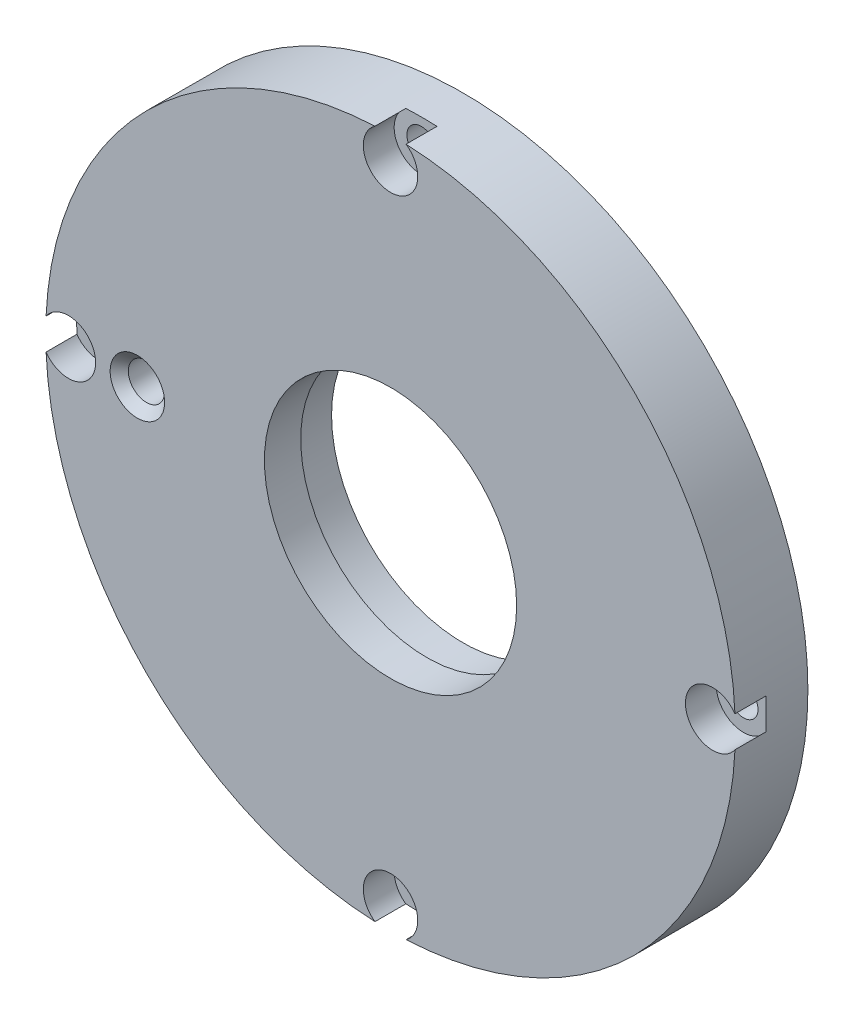
ISO-10303-21;
HEADER;
FILE_DESCRIPTION(('STEP AP214'),'2;1');
FILE_NAME('part.step','',(''),(''),'','','');
FILE_SCHEMA(('AUTOMOTIVE_DESIGN { 1 0 10303 214 1 1 1 1 }'));
ENDSEC;
DATA;
#1=APPLICATION_CONTEXT('core data for automotive mechanical design processes');
#2=APPLICATION_PROTOCOL_DEFINITION('international standard','automotive_design',2000,#1);
#3=PRODUCT_CONTEXT('',#1,'mechanical');
#4=PRODUCT('Part','Part','',(#3));
#5=PRODUCT_RELATED_PRODUCT_CATEGORY('part','',(#4));
#6=PRODUCT_DEFINITION_FORMATION('','',#4);
#7=PRODUCT_DEFINITION_CONTEXT('part definition',#1,'design');
#8=PRODUCT_DEFINITION('design','',#6,#7);
#9=PRODUCT_DEFINITION_SHAPE('','',#8);
#10=(LENGTH_UNIT() NAMED_UNIT(*) SI_UNIT(.MILLI.,.METRE.));
#11=(NAMED_UNIT(*) PLANE_ANGLE_UNIT() SI_UNIT($,.RADIAN.));
#12=(NAMED_UNIT(*) SI_UNIT($,.STERADIAN.) SOLID_ANGLE_UNIT());
#13=UNCERTAINTY_MEASURE_WITH_UNIT(LENGTH_MEASURE(1.E-05),#10,'distance_accuracy_value','');
#14=(GEOMETRIC_REPRESENTATION_CONTEXT(3) GLOBAL_UNCERTAINTY_ASSIGNED_CONTEXT((#13)) GLOBAL_UNIT_ASSIGNED_CONTEXT((#10,
#11,#12)) REPRESENTATION_CONTEXT('',''));
#15=CARTESIAN_POINT('',(0.,0.,0.));
#16=DIRECTION('',(0.,0.,1.));
#17=DIRECTION('',(1.,0.,0.));
#18=AXIS2_PLACEMENT_3D('',#15,#16,#17);
#19=CARTESIAN_POINT('',(0.,0.,0.));
#20=DIRECTION('',(0.,0.,1.));
#21=DIRECTION('',(1.,0.,0.));
#22=AXIS2_PLACEMENT_3D('',#19,#20,#21);
#23=PLANE('',#22);
#24=CARTESIAN_POINT('',(0.,0.,0.));
#25=DIRECTION('',(0.,0.,1.));
#26=DIRECTION('',(1.,0.,0.));
#27=AXIS2_PLACEMENT_3D('',#24,#25,#26);
#28=CIRCLE('',#27,38.);
#29=CARTESIAN_POINT('',(38.,0.,0.));
#30=VERTEX_POINT('',#29);
#31=EDGE_CURVE('E129',#30,#30,#28,.T.);
#32=ORIENTED_EDGE('',*,*,#31,.F.);
#33=EDGE_LOOP('',(#32));
#34=FACE_BOUND('',#33,.T.);
#35=CARTESIAN_POINT('',(-35.5,0.,0.));
#36=DIRECTION('',(0.,0.,1.));
#37=DIRECTION('',(1.,0.,0.));
#38=AXIS2_PLACEMENT_3D('',#35,#36,#37);
#39=CIRCLE('',#38,1.6);
#40=CARTESIAN_POINT('',(-33.9,0.,0.));
#41=VERTEX_POINT('',#40);
#42=EDGE_CURVE('E313',#41,#41,#39,.T.);
#43=ORIENTED_EDGE('',*,*,#42,.T.);
#44=EDGE_LOOP('',(#43));
#45=FACE_BOUND('',#44,.T.);
#46=CARTESIAN_POINT('',(0.,-35.5,0.));
#47=DIRECTION('',(0.,0.,1.));
#48=DIRECTION('',(1.,0.,0.));
#49=AXIS2_PLACEMENT_3D('',#46,#47,#48);
#50=CIRCLE('',#49,1.6);
#51=CARTESIAN_POINT('',(1.6,-35.5,0.));
#52=VERTEX_POINT('',#51);
#53=EDGE_CURVE('E302',#52,#52,#50,.T.);
#54=ORIENTED_EDGE('',*,*,#53,.T.);
#55=EDGE_LOOP('',(#54));
#56=FACE_BOUND('',#55,.T.);
#57=CARTESIAN_POINT('',(35.5,0.,0.));
#58=DIRECTION('',(0.,0.,1.));
#59=DIRECTION('',(1.,0.,0.));
#60=AXIS2_PLACEMENT_3D('',#57,#58,#59);
#61=CIRCLE('',#60,1.6);
#62=CARTESIAN_POINT('',(37.1,0.,0.));
#63=VERTEX_POINT('',#62);
#64=EDGE_CURVE('E291',#63,#63,#61,.T.);
#65=ORIENTED_EDGE('',*,*,#64,.T.);
#66=EDGE_LOOP('',(#65));
#67=FACE_BOUND('',#66,.T.);
#68=CARTESIAN_POINT('',(0.,35.5,0.));
#69=DIRECTION('',(0.,0.,1.));
#70=DIRECTION('',(1.,0.,0.));
#71=AXIS2_PLACEMENT_3D('',#68,#69,#70);
#72=CIRCLE('',#71,1.6);
#73=CARTESIAN_POINT('',(1.6,35.5,0.));
#74=VERTEX_POINT('',#73);
#75=EDGE_CURVE('E283',#74,#74,#72,.T.);
#76=ORIENTED_EDGE('',*,*,#75,.T.);
#77=EDGE_LOOP('',(#76));
#78=FACE_BOUND('',#77,.T.);
#79=CARTESIAN_POINT('',(-27.9,1.07662623062587E-13,0.));
#80=DIRECTION('',(0.,0.,1.));
#81=DIRECTION('',(1.,0.,0.));
#82=AXIS2_PLACEMENT_3D('',#79,#80,#81);
#83=CIRCLE('',#82,2.99999999999999);
#84=CARTESIAN_POINT('',(-24.9,1.07662623062587E-13,0.));
#85=VERTEX_POINT('',#84);
#86=EDGE_CURVE('E45',#85,#85,#83,.T.);
#87=ORIENTED_EDGE('',*,*,#86,.T.);
#88=EDGE_LOOP('',(#87));
#89=FACE_BOUND('',#88,.T.);
#90=CARTESIAN_POINT('',(0.,0.,0.));
#91=DIRECTION('',(0.,0.,1.));
#92=DIRECTION('',(1.,0.,0.));
#93=AXIS2_PLACEMENT_3D('',#90,#91,#92);
#94=CIRCLE('',#93,14.5);
#95=CARTESIAN_POINT('',(14.5,0.,0.));
#96=VERTEX_POINT('',#95);
#97=EDGE_CURVE('E274',#96,#96,#94,.T.);
#98=ORIENTED_EDGE('',*,*,#97,.T.);
#99=EDGE_LOOP('',(#98));
#100=FACE_BOUND('',#99,.T.);
#101=ADVANCED_FACE('F36',(#34,#45,#56,#67,#78,#89,#100),#23,.F.);
#102=CARTESIAN_POINT('',(0.,0.,8.));
#103=DIRECTION('',(0.,0.,1.));
#104=DIRECTION('',(1.,0.,0.));
#105=AXIS2_PLACEMENT_3D('',#102,#103,#104);
#106=PLANE('',#105);
#107=CARTESIAN_POINT('',(-27.9,1.07662623062587E-13,8.));
#108=DIRECTION('',(0.,0.,1.));
#109=DIRECTION('',(1.,0.,0.));
#110=AXIS2_PLACEMENT_3D('',#107,#108,#109);
#111=CIRCLE('',#110,3.00000000000002);
#112=CARTESIAN_POINT('',(-24.9,1.07662623062587E-13,8.));
#113=VERTEX_POINT('',#112);
#114=EDGE_CURVE('E12',#113,#113,#111,.F.);
#115=ORIENTED_EDGE('',*,*,#114,.T.);
#116=EDGE_LOOP('',(#115));
#117=FACE_BOUND('',#116,.T.);
#118=CARTESIAN_POINT('',(0.,35.5,8.));
#119=DIRECTION('',(0.,0.,1.));
#120=DIRECTION('',(1.,0.,0.));
#121=AXIS2_PLACEMENT_3D('',#118,#119,#120);
#122=CIRCLE('',#121,3.);
#123=CARTESIAN_POINT('',(-1.71527309005232,37.9612676056338,8.));
#124=VERTEX_POINT('',#123);
#125=CARTESIAN_POINT('',(1.71527309005232,37.9612676056338,8.));
#126=VERTEX_POINT('',#125);
#127=EDGE_CURVE('E100',#124,#126,#122,.T.);
#128=ORIENTED_EDGE('',*,*,#127,.F.);
#129=CARTESIAN_POINT('',(0.,0.,8.));
#130=DIRECTION('',(0.,0.,1.));
#131=DIRECTION('',(1.,0.,0.));
#132=AXIS2_PLACEMENT_3D('',#129,#130,#131);
#133=CIRCLE('',#132,38.);
#134=CARTESIAN_POINT('',(-37.9612676056338,1.71527309005235,8.));
#135=VERTEX_POINT('',#134);
#136=EDGE_CURVE('E126',#124,#135,#133,.T.);
#137=ORIENTED_EDGE('',*,*,#136,.T.);
#138=CARTESIAN_POINT('',(-35.5,0.,8.));
#139=DIRECTION('',(0.,0.,1.));
#140=DIRECTION('',(1.,0.,0.));
#141=AXIS2_PLACEMENT_3D('',#138,#139,#140);
#142=CIRCLE('',#141,3.);
#143=CARTESIAN_POINT('',(-37.9612676056338,-1.71527309005235,8.));
#144=VERTEX_POINT('',#143);
#145=EDGE_CURVE('E305',#144,#135,#142,.T.);
#146=ORIENTED_EDGE('',*,*,#145,.F.);
#147=CARTESIAN_POINT('',(-1.71527309005231,-37.9612676056338,8.));
#148=VERTEX_POINT('',#147);
#149=EDGE_CURVE('E128',#144,#148,#133,.T.);
#150=ORIENTED_EDGE('',*,*,#149,.T.);
#151=CARTESIAN_POINT('',(0.,-35.5,8.));
#152=DIRECTION('',(0.,0.,1.));
#153=DIRECTION('',(1.,0.,0.));
#154=AXIS2_PLACEMENT_3D('',#151,#152,#153);
#155=CIRCLE('',#154,3.);
#156=CARTESIAN_POINT('',(1.71527309005232,-37.9612676056338,8.));
#157=VERTEX_POINT('',#156);
#158=EDGE_CURVE('E294',#157,#148,#155,.T.);
#159=ORIENTED_EDGE('',*,*,#158,.F.);
#160=CARTESIAN_POINT('',(37.9612676056338,-1.71527309005231,8.));
#161=VERTEX_POINT('',#160);
#162=EDGE_CURVE('E125',#157,#161,#133,.T.);
#163=ORIENTED_EDGE('',*,*,#162,.T.);
#164=CARTESIAN_POINT('',(35.5,0.,8.));
#165=DIRECTION('',(0.,0.,1.));
#166=DIRECTION('',(1.,0.,0.));
#167=AXIS2_PLACEMENT_3D('',#164,#165,#166);
#168=CIRCLE('',#167,3.);
#169=CARTESIAN_POINT('',(37.9612676056338,1.71527309005232,8.));
#170=VERTEX_POINT('',#169);
#171=EDGE_CURVE('E124',#170,#161,#168,.T.);
#172=ORIENTED_EDGE('',*,*,#171,.F.);
#173=EDGE_CURVE('E116',#170,#126,#133,.T.);
#174=ORIENTED_EDGE('',*,*,#173,.T.);
#175=EDGE_LOOP('',(#128,#137,#146,#150,#159,#163,#172,#174));
#176=FACE_BOUND('',#175,.T.);
#177=CARTESIAN_POINT('',(0.,0.,8.));
#178=DIRECTION('',(0.,0.,1.));
#179=DIRECTION('',(1.,0.,0.));
#180=AXIS2_PLACEMENT_3D('',#177,#178,#179);
#181=CIRCLE('',#180,13.9);
#182=CARTESIAN_POINT('',(13.9,0.,8.));
#183=VERTEX_POINT('',#182);
#184=EDGE_CURVE('E134',#183,#183,#181,.T.);
#185=ORIENTED_EDGE('',*,*,#184,.F.);
#186=EDGE_LOOP('',(#185));
#187=FACE_BOUND('',#186,.T.);
#188=ADVANCED_FACE('F121',(#117,#176,#187),#106,.T.);
#189=CARTESIAN_POINT('',(0.,0.,8.));
#190=DIRECTION('',(0.,0.,-1.));
#191=DIRECTION('',(-1.,0.,0.));
#192=AXIS2_PLACEMENT_3D('',#189,#190,#191);
#193=CYLINDRICAL_SURFACE('',#192,38.);
#194=CARTESIAN_POINT('',(0.,0.,4.6));
#195=DIRECTION('',(0.,0.,-1.));
#196=DIRECTION('',(-1.,0.,0.));
#197=AXIS2_PLACEMENT_3D('',#194,#195,#196);
#198=CIRCLE('',#197,38.);
#199=CARTESIAN_POINT('',(-1.71527309005236,37.9612676056338,4.6));
#200=VERTEX_POINT('',#199);
#201=CARTESIAN_POINT('',(1.71527309005232,37.9612676056338,4.6));
#202=VERTEX_POINT('',#201);
#203=EDGE_CURVE('E117',#200,#202,#198,.T.);
#204=ORIENTED_EDGE('',*,*,#203,.T.);
#205=DIRECTION('',(0.,0.,1.));
#206=VECTOR('',#205,1.);
#207=CARTESIAN_POINT('',(1.71527309005236,37.9612676056338,6.3));
#208=LINE('',#207,#206);
#209=EDGE_CURVE('E103',#202,#126,#208,.T.);
#210=ORIENTED_EDGE('',*,*,#209,.T.);
#211=ORIENTED_EDGE('',*,*,#173,.F.);
#212=DIRECTION('',(0.,0.,1.));
#213=VECTOR('',#212,1.);
#214=CARTESIAN_POINT('',(37.9612676056338,1.71527309005236,6.3));
#215=LINE('',#214,#213);
#216=CARTESIAN_POINT('',(37.9612676056338,1.71527309005236,4.6));
#217=VERTEX_POINT('',#216);
#218=EDGE_CURVE('E155',#170,#217,#215,.F.);
#219=ORIENTED_EDGE('',*,*,#218,.T.);
#220=CARTESIAN_POINT('',(0.,0.,4.6));
#221=DIRECTION('',(0.,0.,-1.));
#222=DIRECTION('',(-1.,0.,0.));
#223=AXIS2_PLACEMENT_3D('',#220,#221,#222);
#224=CIRCLE('',#223,38.);
#225=CARTESIAN_POINT('',(37.9612676056338,-1.71527309005235,4.6));
#226=VERTEX_POINT('',#225);
#227=EDGE_CURVE('E157',#217,#226,#224,.T.);
#228=ORIENTED_EDGE('',*,*,#227,.T.);
#229=DIRECTION('',(0.,0.,1.));
#230=VECTOR('',#229,1.);
#231=CARTESIAN_POINT('',(37.9612676056338,-1.71527309005235,6.3));
#232=LINE('',#231,#230);
#233=EDGE_CURVE('E160',#226,#161,#232,.T.);
#234=ORIENTED_EDGE('',*,*,#233,.T.);
#235=ORIENTED_EDGE('',*,*,#162,.F.);
#236=DIRECTION('',(0.,0.,1.));
#237=VECTOR('',#236,1.);
#238=CARTESIAN_POINT('',(1.71527309005236,-37.9612676056338,6.3));
#239=LINE('',#238,#237);
#240=CARTESIAN_POINT('',(1.71527309005236,-37.9612676056338,4.6));
#241=VERTEX_POINT('',#240);
#242=EDGE_CURVE('E146',#157,#241,#239,.F.);
#243=ORIENTED_EDGE('',*,*,#242,.T.);
#244=CARTESIAN_POINT('',(0.,0.,4.6));
#245=DIRECTION('',(0.,0.,-1.));
#246=DIRECTION('',(-1.,0.,0.));
#247=AXIS2_PLACEMENT_3D('',#244,#245,#246);
#248=CIRCLE('',#247,38.);
#249=CARTESIAN_POINT('',(-1.71527309005234,-37.9612676056338,4.6));
#250=VERTEX_POINT('',#249);
#251=EDGE_CURVE('E149',#241,#250,#248,.T.);
#252=ORIENTED_EDGE('',*,*,#251,.T.);
#253=DIRECTION('',(0.,0.,1.));
#254=VECTOR('',#253,1.);
#255=CARTESIAN_POINT('',(-1.71527309005235,-37.9612676056338,6.3));
#256=LINE('',#255,#254);
#257=EDGE_CURVE('E152',#250,#148,#256,.T.);
#258=ORIENTED_EDGE('',*,*,#257,.T.);
#259=ORIENTED_EDGE('',*,*,#149,.F.);
#260=DIRECTION('',(0.,0.,1.));
#261=VECTOR('',#260,1.);
#262=CARTESIAN_POINT('',(-37.9612676056338,-1.71527309005235,6.3));
#263=LINE('',#262,#261);
#264=CARTESIAN_POINT('',(-37.9612676056338,-1.71527309005235,4.6));
#265=VERTEX_POINT('',#264);
#266=EDGE_CURVE('E133',#144,#265,#263,.F.);
#267=ORIENTED_EDGE('',*,*,#266,.T.);
#268=CARTESIAN_POINT('',(0.,0.,4.6));
#269=DIRECTION('',(0.,0.,-1.));
#270=DIRECTION('',(-1.,0.,0.));
#271=AXIS2_PLACEMENT_3D('',#268,#269,#270);
#272=CIRCLE('',#271,38.);
#273=CARTESIAN_POINT('',(-37.9612676056338,1.71527309005235,4.6));
#274=VERTEX_POINT('',#273);
#275=EDGE_CURVE('E140',#265,#274,#272,.T.);
#276=ORIENTED_EDGE('',*,*,#275,.T.);
#277=DIRECTION('',(0.,0.,1.));
#278=VECTOR('',#277,1.);
#279=CARTESIAN_POINT('',(-37.9612676056338,1.71527309005236,6.3));
#280=LINE('',#279,#278);
#281=EDGE_CURVE('E143',#274,#135,#280,.T.);
#282=ORIENTED_EDGE('',*,*,#281,.T.);
#283=ORIENTED_EDGE('',*,*,#136,.F.);
#284=DIRECTION('',(0.,0.,1.));
#285=VECTOR('',#284,1.);
#286=CARTESIAN_POINT('',(-1.71527309005236,37.9612676056338,6.3));
#287=LINE('',#286,#285);
#288=EDGE_CURVE('E105',#124,#200,#287,.F.);
#289=ORIENTED_EDGE('',*,*,#288,.T.);
#290=EDGE_LOOP('',(#204,#210,#211,#219,#228,#234,#235,#243,#252,#258,#259,#267,#276,#282,#283,#289));
#291=FACE_BOUND('',#290,.T.);
#292=ORIENTED_EDGE('',*,*,#31,.T.);
#293=EDGE_LOOP('',(#292));
#294=FACE_BOUND('',#293,.T.);
#295=ADVANCED_FACE('F113',(#291,#294),#193,.T.);
#296=CARTESIAN_POINT('',(0.,0.,8.));
#297=DIRECTION('',(0.,0.,-1.));
#298=DIRECTION('',(-1.,0.,0.));
#299=AXIS2_PLACEMENT_3D('',#296,#297,#298);
#300=CYLINDRICAL_SURFACE('',#299,13.9);
#301=CARTESIAN_POINT('',(0.,0.,4.));
#302=DIRECTION('',(0.,0.,1.));
#303=DIRECTION('',(1.,0.,0.));
#304=AXIS2_PLACEMENT_3D('',#301,#302,#303);
#305=CIRCLE('',#304,13.9);
#306=CARTESIAN_POINT('',(13.9,0.,4.));
#307=VERTEX_POINT('',#306);
#308=EDGE_CURVE('E40',#307,#307,#305,.T.);
#309=ORIENTED_EDGE('',*,*,#308,.F.);
#310=EDGE_LOOP('',(#309));
#311=FACE_BOUND('',#310,.T.);
#312=ORIENTED_EDGE('',*,*,#184,.T.);
#313=EDGE_LOOP('',(#312));
#314=FACE_BOUND('',#313,.T.);
#315=ADVANCED_FACE('F210',(#311,#314),#300,.F.);
#316=CARTESIAN_POINT('',(-33.9,0.,4.6));
#317=DIRECTION('',(0.,0.,-1.));
#318=DIRECTION('',(-1.,0.,0.));
#319=AXIS2_PLACEMENT_3D('',#316,#317,#318);
#320=PLANE('',#319);
#321=CARTESIAN_POINT('',(-35.5,0.,4.6));
#322=DIRECTION('',(0.,0.,1.));
#323=DIRECTION('',(1.,0.,0.));
#324=AXIS2_PLACEMENT_3D('',#321,#322,#323);
#325=CIRCLE('',#324,1.6);
#326=CARTESIAN_POINT('',(-33.9,0.,4.6));
#327=VERTEX_POINT('',#326);
#328=EDGE_CURVE('E311',#327,#327,#325,.T.);
#329=ORIENTED_EDGE('',*,*,#328,.F.);
#330=EDGE_LOOP('',(#329));
#331=FACE_BOUND('',#330,.T.);
#332=CARTESIAN_POINT('',(-35.5,0.,4.6));
#333=DIRECTION('',(0.,0.,1.));
#334=DIRECTION('',(1.,0.,0.));
#335=AXIS2_PLACEMENT_3D('',#332,#333,#334);
#336=CIRCLE('',#335,3.);
#337=EDGE_CURVE('E308',#265,#274,#336,.T.);
#338=ORIENTED_EDGE('',*,*,#337,.T.);
#339=ORIENTED_EDGE('',*,*,#275,.F.);
#340=EDGE_LOOP('',(#338,#339));
#341=FACE_BOUND('',#340,.T.);
#342=ADVANCED_FACE('F214',(#331,#341),#320,.F.);
#343=CARTESIAN_POINT('',(-35.5,0.,8.));
#344=DIRECTION('',(0.,0.,1.));
#345=DIRECTION('',(1.,0.,0.));
#346=AXIS2_PLACEMENT_3D('',#343,#344,#345);
#347=CYLINDRICAL_SURFACE('',#346,3.);
#348=ORIENTED_EDGE('',*,*,#337,.F.);
#349=ORIENTED_EDGE('',*,*,#266,.F.);
#350=ORIENTED_EDGE('',*,*,#145,.T.);
#351=ORIENTED_EDGE('',*,*,#281,.F.);
#352=EDGE_LOOP('',(#348,#349,#350,#351));
#353=FACE_BOUND('',#352,.T.);
#354=ADVANCED_FACE('F219',(#353),#347,.F.);
#355=CARTESIAN_POINT('',(-35.5,0.,8.));
#356=DIRECTION('',(0.,0.,1.));
#357=DIRECTION('',(1.,0.,0.));
#358=AXIS2_PLACEMENT_3D('',#355,#356,#357);
#359=CYLINDRICAL_SURFACE('',#358,1.6);
#360=ORIENTED_EDGE('',*,*,#42,.F.);
#361=EDGE_LOOP('',(#360));
#362=FACE_BOUND('',#361,.T.);
#363=ORIENTED_EDGE('',*,*,#328,.T.);
#364=EDGE_LOOP('',(#363));
#365=FACE_BOUND('',#364,.T.);
#366=ADVANCED_FACE('F225',(#362,#365),#359,.F.);
#367=CARTESIAN_POINT('',(1.6,-35.5,4.6));
#368=DIRECTION('',(0.,0.,-1.));
#369=DIRECTION('',(-1.,0.,0.));
#370=AXIS2_PLACEMENT_3D('',#367,#368,#369);
#371=PLANE('',#370);
#372=CARTESIAN_POINT('',(0.,-35.5,4.6));
#373=DIRECTION('',(0.,0.,1.));
#374=DIRECTION('',(1.,0.,0.));
#375=AXIS2_PLACEMENT_3D('',#372,#373,#374);
#376=CIRCLE('',#375,1.6);
#377=CARTESIAN_POINT('',(1.6,-35.5,4.6));
#378=VERTEX_POINT('',#377);
#379=EDGE_CURVE('E299',#378,#378,#376,.T.);
#380=ORIENTED_EDGE('',*,*,#379,.F.);
#381=EDGE_LOOP('',(#380));
#382=FACE_BOUND('',#381,.T.);
#383=CARTESIAN_POINT('',(0.,-35.5,4.6));
#384=DIRECTION('',(0.,0.,1.));
#385=DIRECTION('',(1.,0.,0.));
#386=AXIS2_PLACEMENT_3D('',#383,#384,#385);
#387=CIRCLE('',#386,3.);
#388=EDGE_CURVE('E296',#241,#250,#387,.T.);
#389=ORIENTED_EDGE('',*,*,#388,.T.);
#390=ORIENTED_EDGE('',*,*,#251,.F.);
#391=EDGE_LOOP('',(#389,#390));
#392=FACE_BOUND('',#391,.T.);
#393=ADVANCED_FACE('F227',(#382,#392),#371,.F.);
#394=CARTESIAN_POINT('',(0.,-35.5,8.));
#395=DIRECTION('',(0.,0.,1.));
#396=DIRECTION('',(1.,0.,0.));
#397=AXIS2_PLACEMENT_3D('',#394,#395,#396);
#398=CYLINDRICAL_SURFACE('',#397,3.);
#399=ORIENTED_EDGE('',*,*,#388,.F.);
#400=ORIENTED_EDGE('',*,*,#242,.F.);
#401=ORIENTED_EDGE('',*,*,#158,.T.);
#402=ORIENTED_EDGE('',*,*,#257,.F.);
#403=EDGE_LOOP('',(#399,#400,#401,#402));
#404=FACE_BOUND('',#403,.T.);
#405=ADVANCED_FACE('F237',(#404),#398,.F.);
#406=CARTESIAN_POINT('',(0.,-35.5,8.));
#407=DIRECTION('',(0.,0.,1.));
#408=DIRECTION('',(1.,0.,0.));
#409=AXIS2_PLACEMENT_3D('',#406,#407,#408);
#410=CYLINDRICAL_SURFACE('',#409,1.6);
#411=ORIENTED_EDGE('',*,*,#53,.F.);
#412=EDGE_LOOP('',(#411));
#413=FACE_BOUND('',#412,.T.);
#414=ORIENTED_EDGE('',*,*,#379,.T.);
#415=EDGE_LOOP('',(#414));
#416=FACE_BOUND('',#415,.T.);
#417=ADVANCED_FACE('F233',(#413,#416),#410,.F.);
#418=CARTESIAN_POINT('',(37.1,0.,4.6));
#419=DIRECTION('',(0.,0.,-1.));
#420=DIRECTION('',(-1.,0.,0.));
#421=AXIS2_PLACEMENT_3D('',#418,#419,#420);
#422=PLANE('',#421);
#423=CARTESIAN_POINT('',(35.5,0.,4.6));
#424=DIRECTION('',(0.,0.,1.));
#425=DIRECTION('',(1.,0.,0.));
#426=AXIS2_PLACEMENT_3D('',#423,#424,#425);
#427=CIRCLE('',#426,1.6);
#428=CARTESIAN_POINT('',(37.1,0.,4.6));
#429=VERTEX_POINT('',#428);
#430=EDGE_CURVE('E288',#429,#429,#427,.T.);
#431=ORIENTED_EDGE('',*,*,#430,.F.);
#432=EDGE_LOOP('',(#431));
#433=FACE_BOUND('',#432,.T.);
#434=CARTESIAN_POINT('',(35.5,0.,4.6));
#435=DIRECTION('',(0.,0.,1.));
#436=DIRECTION('',(1.,0.,0.));
#437=AXIS2_PLACEMENT_3D('',#434,#435,#436);
#438=CIRCLE('',#437,3.);
#439=EDGE_CURVE('E60',#217,#226,#438,.T.);
#440=ORIENTED_EDGE('',*,*,#439,.T.);
#441=ORIENTED_EDGE('',*,*,#227,.F.);
#442=EDGE_LOOP('',(#440,#441));
#443=FACE_BOUND('',#442,.T.);
#444=ADVANCED_FACE('F236',(#433,#443),#422,.F.);
#445=CARTESIAN_POINT('',(35.5,0.,8.));
#446=DIRECTION('',(0.,0.,1.));
#447=DIRECTION('',(1.,0.,0.));
#448=AXIS2_PLACEMENT_3D('',#445,#446,#447);
#449=CYLINDRICAL_SURFACE('',#448,3.);
#450=ORIENTED_EDGE('',*,*,#439,.F.);
#451=ORIENTED_EDGE('',*,*,#218,.F.);
#452=ORIENTED_EDGE('',*,*,#171,.T.);
#453=ORIENTED_EDGE('',*,*,#233,.F.);
#454=EDGE_LOOP('',(#450,#451,#452,#453));
#455=FACE_BOUND('',#454,.T.);
#456=ADVANCED_FACE('F249',(#455),#449,.F.);
#457=CARTESIAN_POINT('',(35.5,0.,8.));
#458=DIRECTION('',(0.,0.,1.));
#459=DIRECTION('',(1.,0.,0.));
#460=AXIS2_PLACEMENT_3D('',#457,#458,#459);
#461=CYLINDRICAL_SURFACE('',#460,1.6);
#462=ORIENTED_EDGE('',*,*,#64,.F.);
#463=EDGE_LOOP('',(#462));
#464=FACE_BOUND('',#463,.T.);
#465=ORIENTED_EDGE('',*,*,#430,.T.);
#466=EDGE_LOOP('',(#465));
#467=FACE_BOUND('',#466,.T.);
#468=ADVANCED_FACE('F245',(#464,#467),#461,.F.);
#469=CARTESIAN_POINT('',(1.6,35.5,4.6));
#470=DIRECTION('',(0.,0.,-1.));
#471=DIRECTION('',(-1.,0.,0.));
#472=AXIS2_PLACEMENT_3D('',#469,#470,#471);
#473=PLANE('',#472);
#474=CARTESIAN_POINT('',(0.,35.5,4.6));
#475=DIRECTION('',(0.,0.,1.));
#476=DIRECTION('',(1.,0.,0.));
#477=AXIS2_PLACEMENT_3D('',#474,#475,#476);
#478=CIRCLE('',#477,1.6);
#479=CARTESIAN_POINT('',(1.6,35.5,4.6));
#480=VERTEX_POINT('',#479);
#481=EDGE_CURVE('E280',#480,#480,#478,.T.);
#482=ORIENTED_EDGE('',*,*,#481,.F.);
#483=EDGE_LOOP('',(#482));
#484=FACE_BOUND('',#483,.T.);
#485=CARTESIAN_POINT('',(0.,35.5,4.6));
#486=DIRECTION('',(0.,0.,1.));
#487=DIRECTION('',(1.,0.,0.));
#488=AXIS2_PLACEMENT_3D('',#485,#486,#487);
#489=CIRCLE('',#488,3.);
#490=EDGE_CURVE('E52',#200,#202,#489,.T.);
#491=ORIENTED_EDGE('',*,*,#490,.T.);
#492=ORIENTED_EDGE('',*,*,#203,.F.);
#493=EDGE_LOOP('',(#491,#492));
#494=FACE_BOUND('',#493,.T.);
#495=ADVANCED_FACE('F248',(#484,#494),#473,.F.);
#496=CARTESIAN_POINT('',(0.,35.5,8.));
#497=DIRECTION('',(0.,0.,1.));
#498=DIRECTION('',(1.,0.,0.));
#499=AXIS2_PLACEMENT_3D('',#496,#497,#498);
#500=CYLINDRICAL_SURFACE('',#499,3.);
#501=ORIENTED_EDGE('',*,*,#490,.F.);
#502=ORIENTED_EDGE('',*,*,#288,.F.);
#503=ORIENTED_EDGE('',*,*,#127,.T.);
#504=ORIENTED_EDGE('',*,*,#209,.F.);
#505=EDGE_LOOP('',(#501,#502,#503,#504));
#506=FACE_BOUND('',#505,.T.);
#507=ADVANCED_FACE('F102',(#506),#500,.F.);
#508=CARTESIAN_POINT('',(0.,35.5,8.));
#509=DIRECTION('',(0.,0.,1.));
#510=DIRECTION('',(1.,0.,0.));
#511=AXIS2_PLACEMENT_3D('',#508,#509,#510);
#512=CYLINDRICAL_SURFACE('',#511,1.6);
#513=ORIENTED_EDGE('',*,*,#75,.F.);
#514=EDGE_LOOP('',(#513));
#515=FACE_BOUND('',#514,.T.);
#516=ORIENTED_EDGE('',*,*,#481,.T.);
#517=EDGE_LOOP('',(#516));
#518=FACE_BOUND('',#517,.T.);
#519=ADVANCED_FACE('F183',(#515,#518),#512,.F.);
#520=CARTESIAN_POINT('',(-27.9,1.07662623062587E-13,0.));
#521=DIRECTION('',(0.,0.,-1.));
#522=DIRECTION('',(-1.,0.,0.));
#523=AXIS2_PLACEMENT_3D('',#520,#521,#522);
#524=CYLINDRICAL_SURFACE('',#523,2.);
#525=CARTESIAN_POINT('',(-27.9,1.07662623062587E-13,0.999999999999982));
#526=DIRECTION('',(0.,0.,1.));
#527=DIRECTION('',(1.,0.,0.));
#528=AXIS2_PLACEMENT_3D('',#525,#526,#527);
#529=CIRCLE('',#528,2.);
#530=CARTESIAN_POINT('',(-25.9,1.07662623062587E-13,0.999999999999982));
#531=VERTEX_POINT('',#530);
#532=EDGE_CURVE('E167',#531,#531,#529,.F.);
#533=ORIENTED_EDGE('',*,*,#532,.T.);
#534=EDGE_LOOP('',(#533));
#535=FACE_BOUND('',#534,.T.);
#536=CARTESIAN_POINT('',(-27.9,1.07662623062587E-13,6.99999999999999));
#537=DIRECTION('',(0.,0.,1.));
#538=DIRECTION('',(1.,0.,0.));
#539=AXIS2_PLACEMENT_3D('',#536,#537,#538);
#540=CIRCLE('',#539,2.);
#541=CARTESIAN_POINT('',(-25.9,1.07662623062587E-13,6.99999999999999));
#542=VERTEX_POINT('',#541);
#543=EDGE_CURVE('E118',#542,#542,#540,.T.);
#544=ORIENTED_EDGE('',*,*,#543,.T.);
#545=EDGE_LOOP('',(#544));
#546=FACE_BOUND('',#545,.T.);
#547=ADVANCED_FACE('F178',(#535,#546),#524,.F.);
#548=CARTESIAN_POINT('',(-27.9,1.07662623062587E-13,0.999999999999982));
#549=DIRECTION('',(0.,0.,-1.));
#550=DIRECTION('',(-1.,0.,0.));
#551=AXIS2_PLACEMENT_3D('',#548,#549,#550);
#552=CONICAL_SURFACE('',#551,2.,0.785398163397452);
#553=ORIENTED_EDGE('',*,*,#86,.F.);
#554=EDGE_LOOP('',(#553));
#555=FACE_BOUND('',#554,.T.);
#556=ORIENTED_EDGE('',*,*,#532,.F.);
#557=EDGE_LOOP('',(#556));
#558=FACE_BOUND('',#557,.T.);
#559=ADVANCED_FACE('F175',(#555,#558),#552,.F.);
#560=CARTESIAN_POINT('',(-27.9,1.07662623062587E-13,6.99999999999999));
#561=DIRECTION('',(0.,0.,1.));
#562=DIRECTION('',(1.,0.,0.));
#563=AXIS2_PLACEMENT_3D('',#560,#561,#562);
#564=CONICAL_SURFACE('',#563,2.,0.785398163397452);
#565=ORIENTED_EDGE('',*,*,#114,.F.);
#566=EDGE_LOOP('',(#565));
#567=FACE_BOUND('',#566,.T.);
#568=ORIENTED_EDGE('',*,*,#543,.F.);
#569=EDGE_LOOP('',(#568));
#570=FACE_BOUND('',#569,.T.);
#571=ADVANCED_FACE('F38',(#567,#570),#564,.F.);
#572=CARTESIAN_POINT('',(0.,0.,49.0121933088198));
#573=DIRECTION('',(0.,0.,-1.));
#574=DIRECTION('',(-1.,0.,0.));
#575=AXIS2_PLACEMENT_3D('',#572,#573,#574);
#576=CYLINDRICAL_SURFACE('',#575,14.5);
#577=ORIENTED_EDGE('',*,*,#97,.F.);
#578=EDGE_LOOP('',(#577));
#579=FACE_BOUND('',#578,.T.);
#580=CARTESIAN_POINT('',(0.,0.,4.));
#581=DIRECTION('',(0.,0.,1.));
#582=DIRECTION('',(1.,0.,0.));
#583=AXIS2_PLACEMENT_3D('',#580,#581,#582);
#584=CIRCLE('',#583,14.5);
#585=CARTESIAN_POINT('',(14.5,0.,4.));
#586=VERTEX_POINT('',#585);
#587=EDGE_CURVE('E272',#586,#586,#584,.T.);
#588=ORIENTED_EDGE('',*,*,#587,.T.);
#589=EDGE_LOOP('',(#588));
#590=FACE_BOUND('',#589,.T.);
#591=ADVANCED_FACE('F188',(#579,#590),#576,.F.);
#592=CARTESIAN_POINT('',(0.,0.,4.));
#593=DIRECTION('',(0.,0.,1.));
#594=DIRECTION('',(1.,0.,0.));
#595=AXIS2_PLACEMENT_3D('',#592,#593,#594);
#596=PLANE('',#595);
#597=ORIENTED_EDGE('',*,*,#308,.T.);
#598=EDGE_LOOP('',(#597));
#599=FACE_BOUND('',#598,.T.);
#600=ORIENTED_EDGE('',*,*,#587,.F.);
#601=EDGE_LOOP('',(#600));
#602=FACE_BOUND('',#601,.T.);
#603=ADVANCED_FACE('F193',(#599,#602),#596,.F.);
#604=CLOSED_SHELL('',(#101,#188,#295,#315,#342,#354,#366,#393,#405,#417,#444,#456,#468,#495,
#507,#519,#547,#559,#571,#591,#603));
#605=MANIFOLD_SOLID_BREP('B2',#604);
#606=ADVANCED_BREP_SHAPE_REPRESENTATION('',(#18,#605),#14);
#607=SHAPE_DEFINITION_REPRESENTATION(#9,#606);
ENDSEC;
END-ISO-10303-21;
